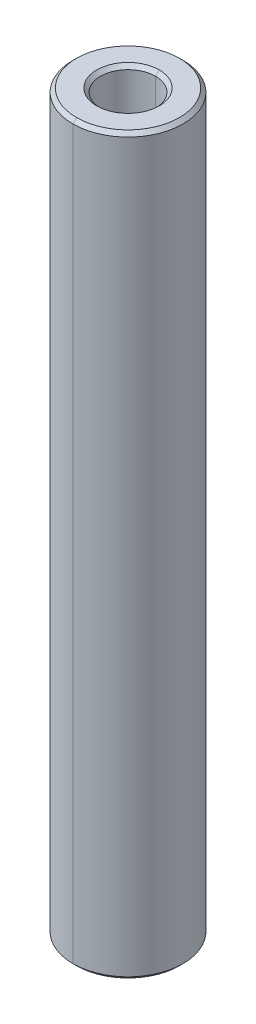
ISO-10303-21;
HEADER;
FILE_DESCRIPTION(('STEP AP214'),'2;1');
FILE_NAME('part.step','',(''),(''),'','','');
FILE_SCHEMA(('AUTOMOTIVE_DESIGN { 1 0 10303 214 1 1 1 1 }'));
ENDSEC;
DATA;
#1=APPLICATION_CONTEXT('core data for automotive mechanical design processes');
#2=APPLICATION_PROTOCOL_DEFINITION('international standard','automotive_design',2000,#1);
#3=PRODUCT_CONTEXT('',#1,'mechanical');
#4=PRODUCT('Part','Part','',(#3));
#5=PRODUCT_RELATED_PRODUCT_CATEGORY('part','',(#4));
#6=PRODUCT_DEFINITION_FORMATION('','',#4);
#7=PRODUCT_DEFINITION_CONTEXT('part definition',#1,'design');
#8=PRODUCT_DEFINITION('design','',#6,#7);
#9=PRODUCT_DEFINITION_SHAPE('','',#8);
#10=(LENGTH_UNIT() NAMED_UNIT(*) SI_UNIT(.MILLI.,.METRE.));
#11=(NAMED_UNIT(*) PLANE_ANGLE_UNIT() SI_UNIT($,.RADIAN.));
#12=(NAMED_UNIT(*) SI_UNIT($,.STERADIAN.) SOLID_ANGLE_UNIT());
#13=UNCERTAINTY_MEASURE_WITH_UNIT(LENGTH_MEASURE(1.E-05),#10,'distance_accuracy_value','');
#14=(GEOMETRIC_REPRESENTATION_CONTEXT(3) GLOBAL_UNCERTAINTY_ASSIGNED_CONTEXT((#13)) GLOBAL_UNIT_ASSIGNED_CONTEXT((#10,
#11,#12)) REPRESENTATION_CONTEXT('',''));
#15=CARTESIAN_POINT('',(0.,0.,0.));
#16=DIRECTION('',(0.,0.,1.));
#17=DIRECTION('',(1.,0.,0.));
#18=AXIS2_PLACEMENT_3D('',#15,#16,#17);
#19=CARTESIAN_POINT('',(0.,40.,0.));
#20=DIRECTION('',(0.,-1.,0.));
#21=DIRECTION('',(0.,0.,-1.));
#22=AXIS2_PLACEMENT_3D('',#19,#20,#21);
#23=PLANE('',#22);
#24=CARTESIAN_POINT('',(0.,40.,0.));
#25=DIRECTION('',(0.,-1.,0.));
#26=DIRECTION('',(0.,0.,-1.));
#27=AXIS2_PLACEMENT_3D('',#24,#25,#26);
#28=CIRCLE('',#27,2.8);
#29=CARTESIAN_POINT('',(0.,40.,2.8));
#30=VERTEX_POINT('',#29);
#31=CARTESIAN_POINT('',(0.,40.,-2.8));
#32=VERTEX_POINT('',#31);
#33=EDGE_CURVE('E11',#30,#32,#28,.T.);
#34=ORIENTED_EDGE('',*,*,#33,.F.);
#35=CARTESIAN_POINT('',(0.,40.,0.));
#36=DIRECTION('',(0.,-1.,0.));
#37=DIRECTION('',(0.,0.,-1.));
#38=AXIS2_PLACEMENT_3D('',#35,#36,#37);
#39=CIRCLE('',#38,2.8);
#40=EDGE_CURVE('E25',#32,#30,#39,.T.);
#41=ORIENTED_EDGE('',*,*,#40,.F.);
#42=EDGE_LOOP('',(#34,#41));
#43=FACE_BOUND('',#42,.T.);
#44=CARTESIAN_POINT('',(0.,40.,0.));
#45=DIRECTION('',(0.,-1.,0.));
#46=DIRECTION('',(0.,0.,-1.));
#47=AXIS2_PLACEMENT_3D('',#44,#45,#46);
#48=CIRCLE('',#47,1.7);
#49=CARTESIAN_POINT('',(0.,40.,-1.7));
#50=VERTEX_POINT('',#49);
#51=CARTESIAN_POINT('',(0.,40.,1.7));
#52=VERTEX_POINT('',#51);
#53=EDGE_CURVE('E194',#50,#52,#48,.T.);
#54=ORIENTED_EDGE('',*,*,#53,.T.);
#55=CARTESIAN_POINT('',(0.,40.,0.));
#56=DIRECTION('',(0.,-1.,0.));
#57=DIRECTION('',(0.,0.,-1.));
#58=AXIS2_PLACEMENT_3D('',#55,#56,#57);
#59=CIRCLE('',#58,1.7);
#60=EDGE_CURVE('E190',#52,#50,#59,.T.);
#61=ORIENTED_EDGE('',*,*,#60,.T.);
#62=EDGE_LOOP('',(#54,#61));
#63=FACE_BOUND('',#62,.T.);
#64=ADVANCED_FACE('F17',(#43,#63),#23,.F.);
#65=CARTESIAN_POINT('',(0.,40.,0.));
#66=DIRECTION('',(0.,1.,0.));
#67=DIRECTION('',(1.,0.,0.));
#68=AXIS2_PLACEMENT_3D('',#65,#66,#67);
#69=CONICAL_SURFACE('',#68,1.7,0.785398163397434);
#70=DIRECTION('',(0.,0.707106781186562,-0.707106781186533));
#71=VECTOR('',#70,1.);
#72=CARTESIAN_POINT('',(0.,39.8,-1.5));
#73=LINE('',#72,#71);
#74=CARTESIAN_POINT('',(0.,39.8,-1.5));
#75=VERTEX_POINT('',#74);
#76=EDGE_CURVE('E185',#75,#50,#73,.T.);
#77=ORIENTED_EDGE('',*,*,#76,.T.);
#78=ORIENTED_EDGE('',*,*,#60,.F.);
#79=DIRECTION('',(0.,0.707106781186562,0.707106781186533));
#80=VECTOR('',#79,1.);
#81=CARTESIAN_POINT('',(0.,39.8,1.5));
#82=LINE('',#81,#80);
#83=CARTESIAN_POINT('',(0.,39.8,1.5));
#84=VERTEX_POINT('',#83);
#85=EDGE_CURVE('E180',#84,#52,#82,.T.);
#86=ORIENTED_EDGE('',*,*,#85,.F.);
#87=CARTESIAN_POINT('',(0.,39.8,0.));
#88=DIRECTION('',(0.,-1.,0.));
#89=DIRECTION('',(0.,0.,-1.));
#90=AXIS2_PLACEMENT_3D('',#87,#88,#89);
#91=CIRCLE('',#90,1.5);
#92=EDGE_CURVE('E176',#84,#75,#91,.T.);
#93=ORIENTED_EDGE('',*,*,#92,.T.);
#94=EDGE_LOOP('',(#77,#78,#86,#93));
#95=FACE_BOUND('',#94,.T.);
#96=ADVANCED_FACE('F211',(#95),#69,.F.);
#97=CARTESIAN_POINT('',(0.,0.,0.));
#98=DIRECTION('',(0.,-1.,0.));
#99=DIRECTION('',(1.,0.,0.));
#100=AXIS2_PLACEMENT_3D('',#97,#98,#99);
#101=CYLINDRICAL_SURFACE('',#100,1.5);
#102=DIRECTION('',(0.,-1.,0.));
#103=VECTOR('',#102,1.);
#104=CARTESIAN_POINT('',(0.,39.8,1.5));
#105=LINE('',#104,#103);
#106=CARTESIAN_POINT('',(0.,0.200000000000003,1.5));
#107=VERTEX_POINT('',#106);
#108=EDGE_CURVE('E172',#84,#107,#105,.T.);
#109=ORIENTED_EDGE('',*,*,#108,.T.);
#110=CARTESIAN_POINT('',(0.,0.2,0.));
#111=DIRECTION('',(0.,-1.,0.));
#112=DIRECTION('',(0.,0.,-1.));
#113=AXIS2_PLACEMENT_3D('',#110,#111,#112);
#114=CIRCLE('',#113,1.5);
#115=CARTESIAN_POINT('',(0.,0.2,-1.5));
#116=VERTEX_POINT('',#115);
#117=EDGE_CURVE('E168',#107,#116,#114,.T.);
#118=ORIENTED_EDGE('',*,*,#117,.T.);
#119=DIRECTION('',(0.,-1.,0.));
#120=VECTOR('',#119,1.);
#121=CARTESIAN_POINT('',(0.,39.8,-1.5));
#122=LINE('',#121,#120);
#123=EDGE_CURVE('E163',#75,#116,#122,.T.);
#124=ORIENTED_EDGE('',*,*,#123,.F.);
#125=ORIENTED_EDGE('',*,*,#92,.F.);
#126=EDGE_LOOP('',(#109,#118,#124,#125));
#127=FACE_BOUND('',#126,.T.);
#128=ADVANCED_FACE('F215',(#127),#101,.F.);
#129=CARTESIAN_POINT('',(0.,0.,0.));
#130=DIRECTION('',(0.,-1.,0.));
#131=DIRECTION('',(-1.,0.,0.));
#132=AXIS2_PLACEMENT_3D('',#129,#130,#131);
#133=CYLINDRICAL_SURFACE('',#132,1.5);
#134=ORIENTED_EDGE('',*,*,#108,.F.);
#135=CARTESIAN_POINT('',(0.,39.8,0.));
#136=DIRECTION('',(0.,-1.,0.));
#137=DIRECTION('',(0.,0.,-1.));
#138=AXIS2_PLACEMENT_3D('',#135,#136,#137);
#139=CIRCLE('',#138,1.5);
#140=EDGE_CURVE('E158',#75,#84,#139,.T.);
#141=ORIENTED_EDGE('',*,*,#140,.F.);
#142=ORIENTED_EDGE('',*,*,#123,.T.);
#143=CARTESIAN_POINT('',(0.,0.2,0.));
#144=DIRECTION('',(0.,-1.,0.));
#145=DIRECTION('',(0.,0.,-1.));
#146=AXIS2_PLACEMENT_3D('',#143,#144,#145);
#147=CIRCLE('',#146,1.5);
#148=EDGE_CURVE('E153',#116,#107,#147,.T.);
#149=ORIENTED_EDGE('',*,*,#148,.T.);
#150=EDGE_LOOP('',(#134,#141,#142,#149));
#151=FACE_BOUND('',#150,.T.);
#152=ADVANCED_FACE('F219',(#151),#133,.F.);
#153=CARTESIAN_POINT('',(0.,0.2,0.));
#154=DIRECTION('',(0.,-1.,0.));
#155=DIRECTION('',(-1.,0.,0.));
#156=AXIS2_PLACEMENT_3D('',#153,#154,#155);
#157=CONICAL_SURFACE('',#156,1.5,0.785398163397451);
#158=DIRECTION('',(0.,-0.707106781186546,0.707106781186549));
#159=VECTOR('',#158,1.);
#160=CARTESIAN_POINT('',(0.,0.2,1.5));
#161=LINE('',#160,#159);
#162=CARTESIAN_POINT('',(0.,0.,1.7));
#163=VERTEX_POINT('',#162);
#164=EDGE_CURVE('E148',#107,#163,#161,.T.);
#165=ORIENTED_EDGE('',*,*,#164,.F.);
#166=ORIENTED_EDGE('',*,*,#148,.F.);
#167=DIRECTION('',(0.,-0.707106781186546,-0.707106781186549));
#168=VECTOR('',#167,1.);
#169=CARTESIAN_POINT('',(0.,0.2,-1.5));
#170=LINE('',#169,#168);
#171=CARTESIAN_POINT('',(0.,0.,-1.7));
#172=VERTEX_POINT('',#171);
#173=EDGE_CURVE('E144',#116,#172,#170,.T.);
#174=ORIENTED_EDGE('',*,*,#173,.T.);
#175=CARTESIAN_POINT('',(0.,0.,0.));
#176=DIRECTION('',(0.,-1.,0.));
#177=DIRECTION('',(0.,0.,-1.));
#178=AXIS2_PLACEMENT_3D('',#175,#176,#177);
#179=CIRCLE('',#178,1.7);
#180=EDGE_CURVE('E140',#172,#163,#179,.T.);
#181=ORIENTED_EDGE('',*,*,#180,.T.);
#182=EDGE_LOOP('',(#165,#166,#174,#181));
#183=FACE_BOUND('',#182,.T.);
#184=ADVANCED_FACE('F223',(#183),#157,.F.);
#185=CARTESIAN_POINT('',(2.8,0.,0.));
#186=DIRECTION('',(0.,1.,0.));
#187=DIRECTION('',(0.,0.,1.));
#188=AXIS2_PLACEMENT_3D('',#185,#186,#187);
#189=PLANE('',#188);
#190=CARTESIAN_POINT('',(0.,0.,0.));
#191=DIRECTION('',(0.,-1.,0.));
#192=DIRECTION('',(0.,0.,-1.));
#193=AXIS2_PLACEMENT_3D('',#190,#191,#192);
#194=CIRCLE('',#193,1.7);
#195=EDGE_CURVE('E135',#163,#172,#194,.T.);
#196=ORIENTED_EDGE('',*,*,#195,.F.);
#197=ORIENTED_EDGE('',*,*,#180,.F.);
#198=EDGE_LOOP('',(#196,#197));
#199=FACE_BOUND('',#198,.T.);
#200=CARTESIAN_POINT('',(0.,0.,0.));
#201=DIRECTION('',(0.,-1.,0.));
#202=DIRECTION('',(0.,0.,-1.));
#203=AXIS2_PLACEMENT_3D('',#200,#201,#202);
#204=CIRCLE('',#203,2.8);
#205=CARTESIAN_POINT('',(0.,0.,-2.8));
#206=VERTEX_POINT('',#205);
#207=CARTESIAN_POINT('',(0.,0.,2.8));
#208=VERTEX_POINT('',#207);
#209=EDGE_CURVE('E131',#206,#208,#204,.T.);
#210=ORIENTED_EDGE('',*,*,#209,.T.);
#211=CARTESIAN_POINT('',(0.,0.,0.));
#212=DIRECTION('',(0.,-1.,0.));
#213=DIRECTION('',(0.,0.,-1.));
#214=AXIS2_PLACEMENT_3D('',#211,#212,#213);
#215=CIRCLE('',#214,2.8);
#216=EDGE_CURVE('E127',#208,#206,#215,.T.);
#217=ORIENTED_EDGE('',*,*,#216,.T.);
#218=EDGE_LOOP('',(#210,#217));
#219=FACE_BOUND('',#218,.T.);
#220=ADVANCED_FACE('F229',(#199,#219),#189,.F.);
#221=CARTESIAN_POINT('',(0.,0.2,0.));
#222=DIRECTION('',(0.,1.,0.));
#223=DIRECTION('',(1.,0.,0.));
#224=AXIS2_PLACEMENT_3D('',#221,#222,#223);
#225=CONICAL_SURFACE('',#224,3.,0.785398163397452);
#226=DIRECTION('',(0.,0.707106781186545,-0.70710678118655));
#227=VECTOR('',#226,1.);
#228=CARTESIAN_POINT('',(0.,0.,-2.8));
#229=LINE('',#228,#227);
#230=CARTESIAN_POINT('',(0.,0.2,-3.));
#231=VERTEX_POINT('',#230);
#232=EDGE_CURVE('E123',#206,#231,#229,.T.);
#233=ORIENTED_EDGE('',*,*,#232,.F.);
#234=ORIENTED_EDGE('',*,*,#216,.F.);
#235=DIRECTION('',(0.,0.707106781186545,0.70710678118655));
#236=VECTOR('',#235,1.);
#237=CARTESIAN_POINT('',(0.,0.,2.8));
#238=LINE('',#237,#236);
#239=CARTESIAN_POINT('',(0.,0.2,3.));
#240=VERTEX_POINT('',#239);
#241=EDGE_CURVE('E119',#208,#240,#238,.T.);
#242=ORIENTED_EDGE('',*,*,#241,.T.);
#243=CARTESIAN_POINT('',(0.,0.2,0.));
#244=DIRECTION('',(0.,-1.,0.));
#245=DIRECTION('',(0.,0.,-1.));
#246=AXIS2_PLACEMENT_3D('',#243,#244,#245);
#247=CIRCLE('',#246,3.);
#248=EDGE_CURVE('E115',#240,#231,#247,.T.);
#249=ORIENTED_EDGE('',*,*,#248,.T.);
#250=EDGE_LOOP('',(#233,#234,#242,#249));
#251=FACE_BOUND('',#250,.T.);
#252=ADVANCED_FACE('F232',(#251),#225,.T.);
#253=CARTESIAN_POINT('',(0.,0.,0.));
#254=DIRECTION('',(0.,-1.,0.));
#255=DIRECTION('',(1.,0.,-1.61702923845784E-09));
#256=AXIS2_PLACEMENT_3D('',#253,#254,#255);
#257=CYLINDRICAL_SURFACE('',#256,3.);
#258=DIRECTION('',(0.,-1.,0.));
#259=VECTOR('',#258,1.);
#260=CARTESIAN_POINT('',(0.,39.8,3.));
#261=LINE('',#260,#259);
#262=CARTESIAN_POINT('',(0.,39.8,2.99999999999999));
#263=VERTEX_POINT('',#262);
#264=EDGE_CURVE('E86',#263,#240,#261,.T.);
#265=ORIENTED_EDGE('',*,*,#264,.F.);
#266=CARTESIAN_POINT('',(0.,39.8,0.));
#267=DIRECTION('',(0.,-1.,0.));
#268=DIRECTION('',(0.,0.,-1.));
#269=AXIS2_PLACEMENT_3D('',#266,#267,#268);
#270=CIRCLE('',#269,3.);
#271=CARTESIAN_POINT('',(0.,39.8,-3.));
#272=VERTEX_POINT('',#271);
#273=EDGE_CURVE('E78',#263,#272,#270,.T.);
#274=ORIENTED_EDGE('',*,*,#273,.T.);
#275=DIRECTION('',(0.,-1.,0.));
#276=VECTOR('',#275,1.);
#277=CARTESIAN_POINT('',(0.,39.8,-3.));
#278=LINE('',#277,#276);
#279=EDGE_CURVE('E83',#272,#231,#278,.T.);
#280=ORIENTED_EDGE('',*,*,#279,.T.);
#281=ORIENTED_EDGE('',*,*,#248,.F.);
#282=EDGE_LOOP('',(#265,#274,#280,#281));
#283=FACE_BOUND('',#282,.T.);
#284=ADVANCED_FACE('F80',(#283),#257,.T.);
#285=CARTESIAN_POINT('',(0.,0.,0.));
#286=DIRECTION('',(0.,-1.,0.));
#287=DIRECTION('',(-1.,0.,0.));
#288=AXIS2_PLACEMENT_3D('',#285,#286,#287);
#289=CYLINDRICAL_SURFACE('',#288,3.);
#290=ORIENTED_EDGE('',*,*,#264,.T.);
#291=CARTESIAN_POINT('',(0.,0.2,0.));
#292=DIRECTION('',(0.,-1.,0.));
#293=DIRECTION('',(0.,0.,-1.));
#294=AXIS2_PLACEMENT_3D('',#291,#292,#293);
#295=CIRCLE('',#294,3.);
#296=EDGE_CURVE('E100',#231,#240,#295,.T.);
#297=ORIENTED_EDGE('',*,*,#296,.F.);
#298=ORIENTED_EDGE('',*,*,#279,.F.);
#299=CARTESIAN_POINT('',(0.,39.8,0.));
#300=DIRECTION('',(0.,-1.,0.));
#301=DIRECTION('',(0.,0.,-1.));
#302=AXIS2_PLACEMENT_3D('',#299,#300,#301);
#303=CIRCLE('',#302,3.);
#304=EDGE_CURVE('E97',#272,#263,#303,.T.);
#305=ORIENTED_EDGE('',*,*,#304,.T.);
#306=EDGE_LOOP('',(#290,#297,#298,#305));
#307=FACE_BOUND('',#306,.T.);
#308=ADVANCED_FACE('F102',(#307),#289,.T.);
#309=CARTESIAN_POINT('',(0.,40.,0.));
#310=DIRECTION('',(0.,-1.,0.));
#311=DIRECTION('',(-1.,0.,0.));
#312=AXIS2_PLACEMENT_3D('',#309,#310,#311);
#313=CONICAL_SURFACE('',#312,2.8,0.785398163397434);
#314=DIRECTION('',(0.,-0.707106781186562,0.707106781186533));
#315=VECTOR('',#314,1.);
#316=CARTESIAN_POINT('',(0.,40.,2.8));
#317=LINE('',#316,#315);
#318=EDGE_CURVE('E94',#30,#263,#317,.T.);
#319=ORIENTED_EDGE('',*,*,#318,.T.);
#320=ORIENTED_EDGE('',*,*,#304,.F.);
#321=DIRECTION('',(0.,-0.707106781186562,-0.707106781186533));
#322=VECTOR('',#321,1.);
#323=CARTESIAN_POINT('',(0.,40.,-2.8));
#324=LINE('',#323,#322);
#325=EDGE_CURVE('E90',#32,#272,#324,.T.);
#326=ORIENTED_EDGE('',*,*,#325,.F.);
#327=ORIENTED_EDGE('',*,*,#40,.T.);
#328=EDGE_LOOP('',(#319,#320,#326,#327));
#329=FACE_BOUND('',#328,.T.);
#330=ADVANCED_FACE('F98',(#329),#313,.T.);
#331=CARTESIAN_POINT('',(0.,40.,0.));
#332=DIRECTION('',(0.,-1.,0.));
#333=DIRECTION('',(1.,0.,0.));
#334=AXIS2_PLACEMENT_3D('',#331,#332,#333);
#335=CONICAL_SURFACE('',#334,2.8,0.785398163397434);
#336=ORIENTED_EDGE('',*,*,#318,.F.);
#337=ORIENTED_EDGE('',*,*,#33,.T.);
#338=ORIENTED_EDGE('',*,*,#325,.T.);
#339=ORIENTED_EDGE('',*,*,#273,.F.);
#340=EDGE_LOOP('',(#336,#337,#338,#339));
#341=FACE_BOUND('',#340,.T.);
#342=ADVANCED_FACE('F92',(#341),#335,.T.);
#343=CARTESIAN_POINT('',(0.,0.2,0.));
#344=DIRECTION('',(0.,1.,0.));
#345=DIRECTION('',(-1.,0.,0.));
#346=AXIS2_PLACEMENT_3D('',#343,#344,#345);
#347=CONICAL_SURFACE('',#346,3.,0.785398163397452);
#348=ORIENTED_EDGE('',*,*,#232,.T.);
#349=ORIENTED_EDGE('',*,*,#296,.T.);
#350=ORIENTED_EDGE('',*,*,#241,.F.);
#351=ORIENTED_EDGE('',*,*,#209,.F.);
#352=EDGE_LOOP('',(#348,#349,#350,#351));
#353=FACE_BOUND('',#352,.T.);
#354=ADVANCED_FACE('F239',(#353),#347,.T.);
#355=CARTESIAN_POINT('',(0.,0.2,0.));
#356=DIRECTION('',(0.,-1.,0.));
#357=DIRECTION('',(1.,0.,0.));
#358=AXIS2_PLACEMENT_3D('',#355,#356,#357);
#359=CONICAL_SURFACE('',#358,1.5,0.785398163397451);
#360=ORIENTED_EDGE('',*,*,#164,.T.);
#361=ORIENTED_EDGE('',*,*,#195,.T.);
#362=ORIENTED_EDGE('',*,*,#173,.F.);
#363=ORIENTED_EDGE('',*,*,#117,.F.);
#364=EDGE_LOOP('',(#360,#361,#362,#363));
#365=FACE_BOUND('',#364,.T.);
#366=ADVANCED_FACE('F227',(#365),#359,.F.);
#367=CARTESIAN_POINT('',(0.,40.,0.));
#368=DIRECTION('',(0.,1.,0.));
#369=DIRECTION('',(-1.,0.,0.));
#370=AXIS2_PLACEMENT_3D('',#367,#368,#369);
#371=CONICAL_SURFACE('',#370,1.7,0.785398163397434);
#372=ORIENTED_EDGE('',*,*,#76,.F.);
#373=ORIENTED_EDGE('',*,*,#140,.T.);
#374=ORIENTED_EDGE('',*,*,#85,.T.);
#375=ORIENTED_EDGE('',*,*,#53,.F.);
#376=EDGE_LOOP('',(#372,#373,#374,#375));
#377=FACE_BOUND('',#376,.T.);
#378=ADVANCED_FACE('F207',(#377),#371,.F.);
#379=CLOSED_SHELL('',(#64,#96,#128,#152,#184,#220,#252,#284,#308,#330,#342,#354,#366,#378));
#380=MANIFOLD_SOLID_BREP('B1',#379);
#381=ADVANCED_BREP_SHAPE_REPRESENTATION('',(#18,#380),#14);
#382=SHAPE_DEFINITION_REPRESENTATION(#9,#381);
ENDSEC;
END-ISO-10303-21;
